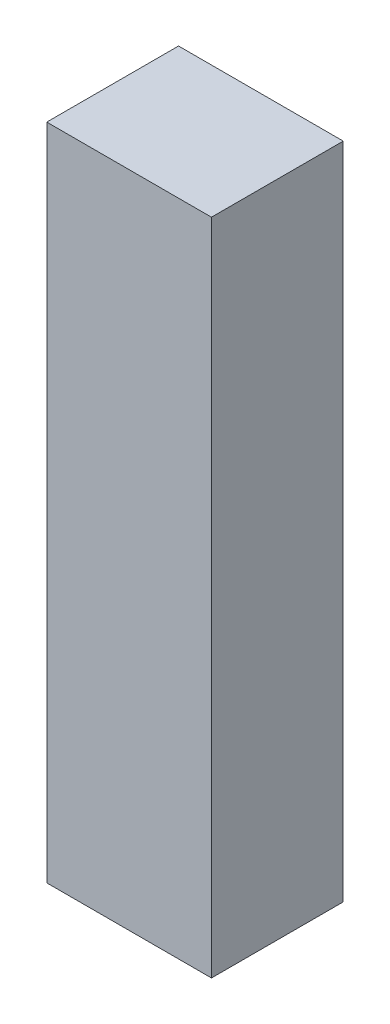
ISO-10303-21;
HEADER;
FILE_DESCRIPTION(('STEP AP214'),'2;1');
FILE_NAME('part.step','',(''),(''),'','','');
FILE_SCHEMA(('AUTOMOTIVE_DESIGN { 1 0 10303 214 1 1 1 1 }'));
ENDSEC;
DATA;
#1=APPLICATION_CONTEXT('core data for automotive mechanical design processes');
#2=APPLICATION_PROTOCOL_DEFINITION('international standard','automotive_design',2000,#1);
#3=PRODUCT_CONTEXT('',#1,'mechanical');
#4=PRODUCT('Part','Part','',(#3));
#5=PRODUCT_RELATED_PRODUCT_CATEGORY('part','',(#4));
#6=PRODUCT_DEFINITION_FORMATION('','',#4);
#7=PRODUCT_DEFINITION_CONTEXT('part definition',#1,'design');
#8=PRODUCT_DEFINITION('design','',#6,#7);
#9=PRODUCT_DEFINITION_SHAPE('','',#8);
#10=(LENGTH_UNIT() NAMED_UNIT(*) SI_UNIT(.MILLI.,.METRE.));
#11=(NAMED_UNIT(*) PLANE_ANGLE_UNIT() SI_UNIT($,.RADIAN.));
#12=(NAMED_UNIT(*) SI_UNIT($,.STERADIAN.) SOLID_ANGLE_UNIT());
#13=UNCERTAINTY_MEASURE_WITH_UNIT(LENGTH_MEASURE(1.E-05),#10,'distance_accuracy_value','');
#14=(GEOMETRIC_REPRESENTATION_CONTEXT(3) GLOBAL_UNCERTAINTY_ASSIGNED_CONTEXT((#13)) GLOBAL_UNIT_ASSIGNED_CONTEXT((#10,
#11,#12)) REPRESENTATION_CONTEXT('',''));
#15=CARTESIAN_POINT('',(0.,0.,0.));
#16=DIRECTION('',(0.,0.,1.));
#17=DIRECTION('',(1.,0.,0.));
#18=AXIS2_PLACEMENT_3D('',#15,#16,#17);
#19=CARTESIAN_POINT('',(520.,330.,-776.));
#20=DIRECTION('',(-1.,0.,0.));
#21=DIRECTION('',(0.,0.,1.));
#22=AXIS2_PLACEMENT_3D('',#19,#20,#21);
#23=PLANE('',#22);
#24=DIRECTION('',(0.,-1.,0.));
#25=VECTOR('',#24,1.);
#26=CARTESIAN_POINT('',(520.,330.,-736.));
#27=LINE('',#26,#25);
#28=CARTESIAN_POINT('',(520.,530.,-736.));
#29=VERTEX_POINT('',#28);
#30=CARTESIAN_POINT('',(520.,330.,-736.));
#31=VERTEX_POINT('',#30);
#32=EDGE_CURVE('E103',#29,#31,#27,.T.);
#33=ORIENTED_EDGE('',*,*,#32,.F.);
#34=DIRECTION('',(0.,0.,1.));
#35=VECTOR('',#34,1.);
#36=CARTESIAN_POINT('',(520.,530.,-776.));
#37=LINE('',#36,#35);
#38=CARTESIAN_POINT('',(520.,530.,-776.));
#39=VERTEX_POINT('',#38);
#40=EDGE_CURVE('E11',#39,#29,#37,.T.);
#41=ORIENTED_EDGE('',*,*,#40,.F.);
#42=DIRECTION('',(0.,-1.,0.));
#43=VECTOR('',#42,1.);
#44=CARTESIAN_POINT('',(520.,330.,-776.));
#45=LINE('',#44,#43);
#46=CARTESIAN_POINT('',(520.,330.,-776.));
#47=VERTEX_POINT('',#46);
#48=EDGE_CURVE('E97',#39,#47,#45,.T.);
#49=ORIENTED_EDGE('',*,*,#48,.T.);
#50=DIRECTION('',(0.,0.,1.));
#51=VECTOR('',#50,1.);
#52=CARTESIAN_POINT('',(520.,330.,-776.));
#53=LINE('',#52,#51);
#54=EDGE_CURVE('E42',#47,#31,#53,.T.);
#55=ORIENTED_EDGE('',*,*,#54,.T.);
#56=EDGE_LOOP('',(#33,#41,#49,#55));
#57=FACE_BOUND('',#56,.T.);
#58=ADVANCED_FACE('F39',(#57),#23,.T.);
#59=CARTESIAN_POINT('',(520.,530.,-776.));
#60=DIRECTION('',(0.,1.,0.));
#61=DIRECTION('',(0.,0.,1.));
#62=AXIS2_PLACEMENT_3D('',#59,#60,#61);
#63=PLANE('',#62);
#64=DIRECTION('',(-1.,0.,0.));
#65=VECTOR('',#64,1.);
#66=CARTESIAN_POINT('',(520.,530.,-736.));
#67=LINE('',#66,#65);
#68=CARTESIAN_POINT('',(570.,530.,-736.));
#69=VERTEX_POINT('',#68);
#70=EDGE_CURVE('E99',#69,#29,#67,.T.);
#71=ORIENTED_EDGE('',*,*,#70,.F.);
#72=DIRECTION('',(0.,0.,1.));
#73=VECTOR('',#72,1.);
#74=CARTESIAN_POINT('',(570.,530.,-776.));
#75=LINE('',#74,#73);
#76=CARTESIAN_POINT('',(570.,530.,-776.));
#77=VERTEX_POINT('',#76);
#78=EDGE_CURVE('E48',#77,#69,#75,.T.);
#79=ORIENTED_EDGE('',*,*,#78,.F.);
#80=DIRECTION('',(-1.,0.,0.));
#81=VECTOR('',#80,1.);
#82=CARTESIAN_POINT('',(520.,530.,-776.));
#83=LINE('',#82,#81);
#84=EDGE_CURVE('E94',#77,#39,#83,.T.);
#85=ORIENTED_EDGE('',*,*,#84,.T.);
#86=ORIENTED_EDGE('',*,*,#40,.T.);
#87=EDGE_LOOP('',(#71,#79,#85,#86));
#88=FACE_BOUND('',#87,.T.);
#89=ADVANCED_FACE('F113',(#88),#63,.T.);
#90=CARTESIAN_POINT('',(570.,330.,-776.));
#91=DIRECTION('',(1.,0.,0.));
#92=DIRECTION('',(0.,0.,-1.));
#93=AXIS2_PLACEMENT_3D('',#90,#91,#92);
#94=PLANE('',#93);
#95=DIRECTION('',(0.,1.,0.));
#96=VECTOR('',#95,1.);
#97=CARTESIAN_POINT('',(570.,330.,-736.));
#98=LINE('',#97,#96);
#99=CARTESIAN_POINT('',(570.,330.,-736.));
#100=VERTEX_POINT('',#99);
#101=EDGE_CURVE('E89',#100,#69,#98,.T.);
#102=ORIENTED_EDGE('',*,*,#101,.F.);
#103=DIRECTION('',(0.,0.,1.));
#104=VECTOR('',#103,1.);
#105=CARTESIAN_POINT('',(570.,330.,-776.));
#106=LINE('',#105,#104);
#107=CARTESIAN_POINT('',(570.,330.,-776.));
#108=VERTEX_POINT('',#107);
#109=EDGE_CURVE('E84',#108,#100,#106,.T.);
#110=ORIENTED_EDGE('',*,*,#109,.F.);
#111=DIRECTION('',(0.,1.,0.));
#112=VECTOR('',#111,1.);
#113=CARTESIAN_POINT('',(570.,330.,-776.));
#114=LINE('',#113,#112);
#115=EDGE_CURVE('E87',#108,#77,#114,.T.);
#116=ORIENTED_EDGE('',*,*,#115,.T.);
#117=ORIENTED_EDGE('',*,*,#78,.T.);
#118=EDGE_LOOP('',(#102,#110,#116,#117));
#119=FACE_BOUND('',#118,.T.);
#120=ADVANCED_FACE('F86',(#119),#94,.T.);
#121=CARTESIAN_POINT('',(520.,330.,-776.));
#122=DIRECTION('',(0.,-1.,0.));
#123=DIRECTION('',(0.,0.,-1.));
#124=AXIS2_PLACEMENT_3D('',#121,#122,#123);
#125=PLANE('',#124);
#126=DIRECTION('',(1.,0.,0.));
#127=VECTOR('',#126,1.);
#128=CARTESIAN_POINT('',(520.,330.,-736.));
#129=LINE('',#128,#127);
#130=EDGE_CURVE('E106',#31,#100,#129,.T.);
#131=ORIENTED_EDGE('',*,*,#130,.F.);
#132=ORIENTED_EDGE('',*,*,#54,.F.);
#133=DIRECTION('',(1.,0.,0.));
#134=VECTOR('',#133,1.);
#135=CARTESIAN_POINT('',(520.,330.,-776.));
#136=LINE('',#135,#134);
#137=EDGE_CURVE('E93',#47,#108,#136,.T.);
#138=ORIENTED_EDGE('',*,*,#137,.T.);
#139=ORIENTED_EDGE('',*,*,#109,.T.);
#140=EDGE_LOOP('',(#131,#132,#138,#139));
#141=FACE_BOUND('',#140,.T.);
#142=ADVANCED_FACE('F96',(#141),#125,.T.);
#143=CARTESIAN_POINT('',(0.,0.,-776.));
#144=DIRECTION('',(0.,0.,-1.));
#145=DIRECTION('',(-1.,0.,0.));
#146=AXIS2_PLACEMENT_3D('',#143,#144,#145);
#147=PLANE('',#146);
#148=ORIENTED_EDGE('',*,*,#48,.F.);
#149=ORIENTED_EDGE('',*,*,#84,.F.);
#150=ORIENTED_EDGE('',*,*,#115,.F.);
#151=ORIENTED_EDGE('',*,*,#137,.F.);
#152=EDGE_LOOP('',(#148,#149,#150,#151));
#153=FACE_BOUND('',#152,.T.);
#154=ADVANCED_FACE('F92',(#153),#147,.T.);
#155=CARTESIAN_POINT('',(0.,0.,-736.));
#156=DIRECTION('',(0.,0.,-1.));
#157=DIRECTION('',(-1.,0.,0.));
#158=AXIS2_PLACEMENT_3D('',#155,#156,#157);
#159=PLANE('',#158);
#160=ORIENTED_EDGE('',*,*,#32,.T.);
#161=ORIENTED_EDGE('',*,*,#130,.T.);
#162=ORIENTED_EDGE('',*,*,#101,.T.);
#163=ORIENTED_EDGE('',*,*,#70,.T.);
#164=EDGE_LOOP('',(#160,#161,#162,#163));
#165=FACE_BOUND('',#164,.T.);
#166=ADVANCED_FACE('F112',(#165),#159,.F.);
#167=CLOSED_SHELL('',(#58,#89,#120,#142,#154,#166));
#168=MANIFOLD_SOLID_BREP('B2',#167);
#169=ADVANCED_BREP_SHAPE_REPRESENTATION('',(#18,#168),#14);
#170=SHAPE_DEFINITION_REPRESENTATION(#9,#169);
ENDSEC;
END-ISO-10303-21;
